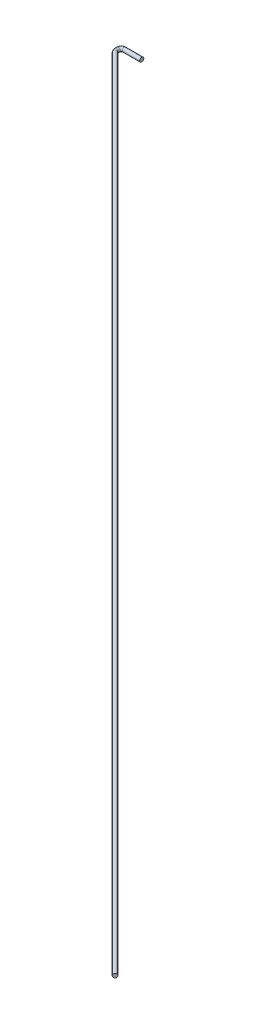
ISO-10303-21;
HEADER;
FILE_DESCRIPTION(('STEP AP214'),'2;1');
FILE_NAME('part.step','',(''),(''),'','','');
FILE_SCHEMA(('AUTOMOTIVE_DESIGN { 1 0 10303 214 1 1 1 1 }'));
ENDSEC;
DATA;
#1=APPLICATION_CONTEXT('core data for automotive mechanical design processes');
#2=APPLICATION_PROTOCOL_DEFINITION('international standard','automotive_design',2000,#1);
#3=PRODUCT_CONTEXT('',#1,'mechanical');
#4=PRODUCT('Part','Part','',(#3));
#5=PRODUCT_RELATED_PRODUCT_CATEGORY('part','',(#4));
#6=PRODUCT_DEFINITION_FORMATION('','',#4);
#7=PRODUCT_DEFINITION_CONTEXT('part definition',#1,'design');
#8=PRODUCT_DEFINITION('design','',#6,#7);
#9=PRODUCT_DEFINITION_SHAPE('','',#8);
#10=(LENGTH_UNIT() NAMED_UNIT(*) SI_UNIT(.MILLI.,.METRE.));
#11=(NAMED_UNIT(*) PLANE_ANGLE_UNIT() SI_UNIT($,.RADIAN.));
#12=(NAMED_UNIT(*) SI_UNIT($,.STERADIAN.) SOLID_ANGLE_UNIT());
#13=UNCERTAINTY_MEASURE_WITH_UNIT(LENGTH_MEASURE(1.E-05),#10,'distance_accuracy_value','');
#14=(GEOMETRIC_REPRESENTATION_CONTEXT(3) GLOBAL_UNCERTAINTY_ASSIGNED_CONTEXT((#13)) GLOBAL_UNIT_ASSIGNED_CONTEXT((#10,
#11,#12)) REPRESENTATION_CONTEXT('',''));
#15=CARTESIAN_POINT('',(0.,0.,0.));
#16=DIRECTION('',(0.,0.,1.));
#17=DIRECTION('',(1.,0.,0.));
#18=AXIS2_PLACEMENT_3D('',#15,#16,#17);
#19=CARTESIAN_POINT('',(10.,0.,-3.));
#20=DIRECTION('',(1.,0.,0.));
#21=DIRECTION('',(0.,0.,-1.));
#22=AXIS2_PLACEMENT_3D('',#19,#20,#21);
#23=PLANE('',#22);
#24=CARTESIAN_POINT('',(10.,0.,-3.));
#25=DIRECTION('',(1.,0.,0.));
#26=DIRECTION('',(0.,0.,-1.));
#27=AXIS2_PLACEMENT_3D('',#24,#25,#26);
#28=CIRCLE('',#27,1.);
#29=CARTESIAN_POINT('',(10.,0.,-4.));
#30=VERTEX_POINT('',#29);
#31=EDGE_CURVE('E64',#30,#30,#28,.T.);
#32=ORIENTED_EDGE('',*,*,#31,.T.);
#33=EDGE_LOOP('',(#32));
#34=FACE_BOUND('',#33,.T.);
#35=ADVANCED_FACE('F37',(#34),#23,.T.);
#36=CARTESIAN_POINT('',(390.817917961803,0.,390.817917961807));
#37=DIRECTION('',(-0.707106781186544,0.,-0.707106781186551));
#38=DIRECTION('',(-0.707106781186551,0.,0.707106781186544));
#39=AXIS2_PLACEMENT_3D('',#36,#37,#38);
#40=PLANE('',#39);
#41=CARTESIAN_POINT('',(390.817917961803,0.,390.817917961807));
#42=DIRECTION('',(-0.707106781186544,0.,-0.707106781186551));
#43=DIRECTION('',(-0.707106781186551,0.,0.707106781186544));
#44=AXIS2_PLACEMENT_3D('',#41,#42,#43);
#45=CIRCLE('',#44,1.);
#46=CARTESIAN_POINT('',(390.110811180616,0.,391.525024742993));
#47=VERTEX_POINT('',#46);
#48=EDGE_CURVE('E10',#47,#47,#45,.T.);
#49=ORIENTED_EDGE('',*,*,#48,.F.);
#50=EDGE_LOOP('',(#49));
#51=FACE_BOUND('',#50,.T.);
#52=ADVANCED_FACE('F73',(#51),#40,.F.);
#53=CARTESIAN_POINT('',(10.,0.,-3.));
#54=DIRECTION('',(-1.,0.,0.));
#55=DIRECTION('',(0.,0.,1.));
#56=AXIS2_PLACEMENT_3D('',#53,#54,#55);
#57=CYLINDRICAL_SURFACE('',#56,1.);
#58=CARTESIAN_POINT('',(1.50000000000001,0.,-3.));
#59=DIRECTION('',(1.,0.,0.));
#60=DIRECTION('',(0.,0.,-1.));
#61=AXIS2_PLACEMENT_3D('',#58,#59,#60);
#62=CIRCLE('',#61,1.);
#63=CARTESIAN_POINT('',(1.50000000000002,0.,-4.00000000000007));
#64=VERTEX_POINT('',#63);
#65=EDGE_CURVE('E60',#64,#64,#62,.T.);
#66=ORIENTED_EDGE('',*,*,#65,.T.);
#67=EDGE_LOOP('',(#66));
#68=FACE_BOUND('',#67,.T.);
#69=ORIENTED_EDGE('',*,*,#31,.F.);
#70=EDGE_LOOP('',(#69));
#71=FACE_BOUND('',#70,.T.);
#72=ADVANCED_FACE('F70',(#68,#71),#57,.T.);
#73=CARTESIAN_POINT('',(1.5,0.,-1.5));
#74=DIRECTION('',(0.,1.,0.));
#75=DIRECTION('',(0.,0.,1.));
#76=AXIS2_PLACEMENT_3D('',#73,#74,#75);
#77=TOROIDAL_SURFACE('',#76,1.50000000000007,1.);
#78=CARTESIAN_POINT('',(0.,0.,-1.49999999999999));
#79=DIRECTION('',(0.,0.,-1.));
#80=DIRECTION('',(-1.,0.,0.));
#81=AXIS2_PLACEMENT_3D('',#78,#79,#80);
#82=CIRCLE('',#81,1.);
#83=CARTESIAN_POINT('',(-1.00000000000007,0.,-1.49999999999998));
#84=VERTEX_POINT('',#83);
#85=EDGE_CURVE('E54',#84,#84,#82,.T.);
#86=CARTESIAN_POINT('',(1.5,0.,-1.5));
#87=DIRECTION('',(0.,1.,0.));
#88=DIRECTION('',(0.,0.,1.));
#89=AXIS2_PLACEMENT_3D('',#86,#87,#88);
#90=CIRCLE('',#89,2.50000000000007);
#91=EDGE_CURVE('',#64,#84,#90,.T.);
#92=ORIENTED_EDGE('',*,*,#65,.F.);
#93=ORIENTED_EDGE('',*,*,#85,.T.);
#94=ORIENTED_EDGE('',*,*,#91,.T.);
#95=ORIENTED_EDGE('',*,*,#91,.F.);
#96=EDGE_LOOP('',(#92,#94,#93,#95));
#97=FACE_BOUND('',#96,.T.);
#98=ADVANCED_FACE('F72',(#97),#77,.T.);
#99=CARTESIAN_POINT('',(0.,0.,-1.49999999999999));
#100=DIRECTION('',(0.,0.,1.));
#101=DIRECTION('',(1.,0.,0.));
#102=AXIS2_PLACEMENT_3D('',#99,#100,#101);
#103=CYLINDRICAL_SURFACE('',#102,1.);
#104=CARTESIAN_POINT('',(0.,0.,-0.621320343559637));
#105=DIRECTION('',(0.,0.,-1.));
#106=DIRECTION('',(-1.,0.,0.));
#107=AXIS2_PLACEMENT_3D('',#104,#105,#106);
#108=CIRCLE('',#107,1.);
#109=CARTESIAN_POINT('',(-1.,0.,-0.621320343559637));
#110=VERTEX_POINT('',#109);
#111=EDGE_CURVE('E49',#110,#110,#108,.T.);
#112=ORIENTED_EDGE('',*,*,#111,.T.);
#113=EDGE_LOOP('',(#112));
#114=FACE_BOUND('',#113,.T.);
#115=ORIENTED_EDGE('',*,*,#85,.F.);
#116=EDGE_LOOP('',(#115));
#117=FACE_BOUND('',#116,.T.);
#118=ADVANCED_FACE('F80',(#114,#117),#103,.T.);
#119=CARTESIAN_POINT('',(1.5,0.,-0.621320343559638));
#120=DIRECTION('',(0.,1.,0.));
#121=DIRECTION('',(0.,0.,1.));
#122=AXIS2_PLACEMENT_3D('',#119,#120,#121);
#123=TOROIDAL_SURFACE('',#122,1.5,1.);
#124=CARTESIAN_POINT('',(0.439339828220173,0.,0.439339828220177));
#125=DIRECTION('',(-0.707106781186544,0.,-0.707106781186551));
#126=DIRECTION('',(-0.707106781186551,0.,0.707106781186544));
#127=AXIS2_PLACEMENT_3D('',#124,#125,#126);
#128=CIRCLE('',#127,1.);
#129=CARTESIAN_POINT('',(-0.267766952966378,0.,1.14644660940672));
#130=VERTEX_POINT('',#129);
#131=EDGE_CURVE('E44',#130,#130,#128,.T.);
#132=CARTESIAN_POINT('',(1.5,0.,-0.621320343559638));
#133=DIRECTION('',(0.,1.,0.));
#134=DIRECTION('',(0.,0.,1.));
#135=AXIS2_PLACEMENT_3D('',#132,#133,#134);
#136=CIRCLE('',#135,2.5);
#137=EDGE_CURVE('',#110,#130,#136,.T.);
#138=ORIENTED_EDGE('',*,*,#111,.F.);
#139=ORIENTED_EDGE('',*,*,#131,.T.);
#140=ORIENTED_EDGE('',*,*,#137,.T.);
#141=ORIENTED_EDGE('',*,*,#137,.F.);
#142=EDGE_LOOP('',(#138,#140,#139,#141));
#143=FACE_BOUND('',#142,.T.);
#144=ADVANCED_FACE('F86',(#143),#123,.T.);
#145=CARTESIAN_POINT('',(0.439339828220173,0.,0.439339828220177));
#146=DIRECTION('',(0.707106781186544,0.,0.707106781186551));
#147=DIRECTION('',(0.707106781186551,0.,-0.707106781186544));
#148=AXIS2_PLACEMENT_3D('',#145,#146,#147);
#149=CYLINDRICAL_SURFACE('',#148,1.);
#150=ORIENTED_EDGE('',*,*,#48,.T.);
#151=EDGE_LOOP('',(#150));
#152=FACE_BOUND('',#151,.T.);
#153=ORIENTED_EDGE('',*,*,#131,.F.);
#154=EDGE_LOOP('',(#153));
#155=FACE_BOUND('',#154,.T.);
#156=ADVANCED_FACE('F84',(#152,#155),#149,.T.);
#157=CLOSED_SHELL('',(#35,#52,#72,#98,#118,#144,#156));
#158=MANIFOLD_SOLID_BREP('B2',#157);
#159=ADVANCED_BREP_SHAPE_REPRESENTATION('',(#18,#158),#14);
#160=SHAPE_DEFINITION_REPRESENTATION(#9,#159);
ENDSEC;
END-ISO-10303-21;
